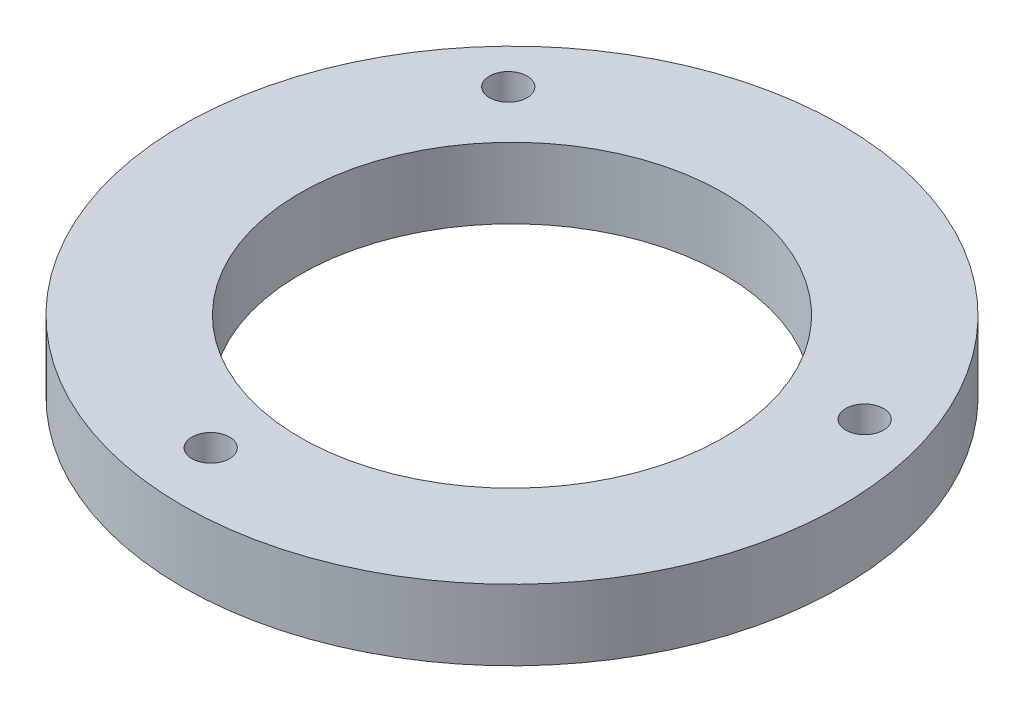
ISO-10303-21;
HEADER;
FILE_DESCRIPTION(('STEP AP214'),'2;1');
FILE_NAME('part.step','',(''),(''),'','','');
FILE_SCHEMA(('AUTOMOTIVE_DESIGN { 1 0 10303 214 1 1 1 1 }'));
ENDSEC;
DATA;
#1=APPLICATION_CONTEXT('core data for automotive mechanical design processes');
#2=APPLICATION_PROTOCOL_DEFINITION('international standard','automotive_design',2000,#1);
#3=PRODUCT_CONTEXT('',#1,'mechanical');
#4=PRODUCT('Part','Part','',(#3));
#5=PRODUCT_RELATED_PRODUCT_CATEGORY('part','',(#4));
#6=PRODUCT_DEFINITION_FORMATION('','',#4);
#7=PRODUCT_DEFINITION_CONTEXT('part definition',#1,'design');
#8=PRODUCT_DEFINITION('design','',#6,#7);
#9=PRODUCT_DEFINITION_SHAPE('','',#8);
#10=(LENGTH_UNIT() NAMED_UNIT(*) SI_UNIT(.MILLI.,.METRE.));
#11=(NAMED_UNIT(*) PLANE_ANGLE_UNIT() SI_UNIT($,.RADIAN.));
#12=(NAMED_UNIT(*) SI_UNIT($,.STERADIAN.) SOLID_ANGLE_UNIT());
#13=UNCERTAINTY_MEASURE_WITH_UNIT(LENGTH_MEASURE(1.E-05),#10,'distance_accuracy_value','');
#14=(GEOMETRIC_REPRESENTATION_CONTEXT(3) GLOBAL_UNCERTAINTY_ASSIGNED_CONTEXT((#13)) GLOBAL_UNIT_ASSIGNED_CONTEXT((#10,
#11,#12)) REPRESENTATION_CONTEXT('',''));
#15=CARTESIAN_POINT('',(0.,0.,0.));
#16=DIRECTION('',(0.,0.,1.));
#17=DIRECTION('',(1.,0.,0.));
#18=AXIS2_PLACEMENT_3D('',#15,#16,#17);
#19=CARTESIAN_POINT('',(0.,7.62,0.));
#20=DIRECTION('',(0.,1.,0.));
#21=DIRECTION('',(0.,0.,1.));
#22=AXIS2_PLACEMENT_3D('',#19,#20,#21);
#23=PLANE('',#22);
#24=CARTESIAN_POINT('',(28.7517939187734,7.62,-9.29972339541891));
#25=DIRECTION('',(0.,1.,0.));
#26=DIRECTION('',(0.,0.,1.));
#27=AXIS2_PLACEMENT_3D('',#24,#25,#26);
#28=CIRCLE('',#27,2.032);
#29=CARTESIAN_POINT('',(28.7517939187734,7.62,-7.26772339541891));
#30=VERTEX_POINT('',#29);
#31=EDGE_CURVE('E62',#30,#30,#28,.T.);
#32=ORIENTED_EDGE('',*,*,#31,.F.);
#33=EDGE_LOOP('',(#32));
#34=FACE_BOUND('',#33,.T.);
#35=CARTESIAN_POINT('',(-3.86372480179012,7.62,28.6479956742244));
#36=DIRECTION('',(0.,1.,0.));
#37=DIRECTION('',(0.,0.,1.));
#38=AXIS2_PLACEMENT_3D('',#35,#36,#37);
#39=CIRCLE('',#38,2.032);
#40=CARTESIAN_POINT('',(-3.86372480179012,7.62,30.6799956742244));
#41=VERTEX_POINT('',#40);
#42=EDGE_CURVE('E56',#41,#41,#39,.T.);
#43=ORIENTED_EDGE('',*,*,#42,.F.);
#44=EDGE_LOOP('',(#43));
#45=FACE_BOUND('',#44,.T.);
#46=CARTESIAN_POINT('',(-21.5402060812266,7.62,-21.1360043257756));
#47=DIRECTION('',(0.,1.,0.));
#48=DIRECTION('',(0.,0.,1.));
#49=AXIS2_PLACEMENT_3D('',#46,#47,#48);
#50=CIRCLE('',#49,2.032);
#51=CARTESIAN_POINT('',(-21.5402060812266,7.62,-19.1040043257756));
#52=VERTEX_POINT('',#51);
#53=EDGE_CURVE('E50',#52,#52,#50,.T.);
#54=ORIENTED_EDGE('',*,*,#53,.F.);
#55=EDGE_LOOP('',(#54));
#56=FACE_BOUND('',#55,.T.);
#57=CARTESIAN_POINT('',(0.,7.62,0.));
#58=DIRECTION('',(0.,1.,0.));
#59=DIRECTION('',(0.,0.,1.));
#60=AXIS2_PLACEMENT_3D('',#57,#58,#59);
#61=CIRCLE('',#60,35.56);
#62=CARTESIAN_POINT('',(0.,7.62,-35.56));
#63=VERTEX_POINT('',#62);
#64=EDGE_CURVE('E10',#63,#63,#61,.T.);
#65=ORIENTED_EDGE('',*,*,#64,.T.);
#66=EDGE_LOOP('',(#65));
#67=FACE_BOUND('',#66,.T.);
#68=CARTESIAN_POINT('',(0.,7.62,0.));
#69=DIRECTION('',(0.,1.,0.));
#70=DIRECTION('',(0.,0.,1.));
#71=AXIS2_PLACEMENT_3D('',#68,#69,#70);
#72=CIRCLE('',#71,22.86);
#73=CARTESIAN_POINT('',(0.,7.62,-22.86));
#74=VERTEX_POINT('',#73);
#75=EDGE_CURVE('E42',#74,#74,#72,.T.);
#76=ORIENTED_EDGE('',*,*,#75,.F.);
#77=EDGE_LOOP('',(#76));
#78=FACE_BOUND('',#77,.T.);
#79=ADVANCED_FACE('F31',(#34,#45,#56,#67,#78),#23,.T.);
#80=CARTESIAN_POINT('',(0.,0.,0.));
#81=DIRECTION('',(0.,1.,0.));
#82=DIRECTION('',(0.,0.,1.));
#83=AXIS2_PLACEMENT_3D('',#80,#81,#82);
#84=PLANE('',#83);
#85=CARTESIAN_POINT('',(28.7517939187734,0.,-9.29972339541891));
#86=DIRECTION('',(0.,1.,0.));
#87=DIRECTION('',(0.,0.,1.));
#88=AXIS2_PLACEMENT_3D('',#85,#86,#87);
#89=CIRCLE('',#88,2.032);
#90=CARTESIAN_POINT('',(28.7517939187734,0.,-7.26772339541891));
#91=VERTEX_POINT('',#90);
#92=EDGE_CURVE('E47',#91,#91,#89,.T.);
#93=ORIENTED_EDGE('',*,*,#92,.T.);
#94=EDGE_LOOP('',(#93));
#95=FACE_BOUND('',#94,.T.);
#96=CARTESIAN_POINT('',(-3.86372480179012,0.,28.6479956742244));
#97=DIRECTION('',(0.,1.,0.));
#98=DIRECTION('',(0.,0.,1.));
#99=AXIS2_PLACEMENT_3D('',#96,#97,#98);
#100=CIRCLE('',#99,2.032);
#101=CARTESIAN_POINT('',(-3.86372480179012,0.,30.6799956742244));
#102=VERTEX_POINT('',#101);
#103=EDGE_CURVE('E59',#102,#102,#100,.T.);
#104=ORIENTED_EDGE('',*,*,#103,.T.);
#105=EDGE_LOOP('',(#104));
#106=FACE_BOUND('',#105,.T.);
#107=CARTESIAN_POINT('',(-21.5402060812266,0.,-21.1360043257756));
#108=DIRECTION('',(0.,1.,0.));
#109=DIRECTION('',(0.,0.,1.));
#110=AXIS2_PLACEMENT_3D('',#107,#108,#109);
#111=CIRCLE('',#110,2.032);
#112=CARTESIAN_POINT('',(-21.5402060812266,0.,-19.1040043257756));
#113=VERTEX_POINT('',#112);
#114=EDGE_CURVE('E53',#113,#113,#111,.T.);
#115=ORIENTED_EDGE('',*,*,#114,.T.);
#116=EDGE_LOOP('',(#115));
#117=FACE_BOUND('',#116,.T.);
#118=CARTESIAN_POINT('',(0.,0.,0.));
#119=DIRECTION('',(0.,1.,0.));
#120=DIRECTION('',(0.,0.,1.));
#121=AXIS2_PLACEMENT_3D('',#118,#119,#120);
#122=CIRCLE('',#121,35.56);
#123=CARTESIAN_POINT('',(0.,0.,-35.56));
#124=VERTEX_POINT('',#123);
#125=EDGE_CURVE('E35',#124,#124,#122,.T.);
#126=ORIENTED_EDGE('',*,*,#125,.F.);
#127=EDGE_LOOP('',(#126));
#128=FACE_BOUND('',#127,.T.);
#129=CARTESIAN_POINT('',(0.,0.,0.));
#130=DIRECTION('',(0.,1.,0.));
#131=DIRECTION('',(0.,0.,1.));
#132=AXIS2_PLACEMENT_3D('',#129,#130,#131);
#133=CIRCLE('',#132,22.86);
#134=CARTESIAN_POINT('',(0.,0.,-22.86));
#135=VERTEX_POINT('',#134);
#136=EDGE_CURVE('E44',#135,#135,#133,.T.);
#137=ORIENTED_EDGE('',*,*,#136,.T.);
#138=EDGE_LOOP('',(#137));
#139=FACE_BOUND('',#138,.T.);
#140=ADVANCED_FACE('F68',(#95,#106,#117,#128,#139),#84,.F.);
#141=CARTESIAN_POINT('',(0.,7.62,0.));
#142=DIRECTION('',(0.,-1.,0.));
#143=DIRECTION('',(0.,0.,-1.));
#144=AXIS2_PLACEMENT_3D('',#141,#142,#143);
#145=CYLINDRICAL_SURFACE('',#144,35.56);
#146=CARTESIAN_POINT('',(0.,7.62,-35.56));
#147=CARTESIAN_POINT('',(0.,7.540625,-35.56));
#148=CARTESIAN_POINT('',(0.,7.46125,-35.56));
#149=CARTESIAN_POINT('',(0.,7.3025,-35.56));
#150=CARTESIAN_POINT('',(0.,7.223125,-35.56));
#151=CARTESIAN_POINT('',(0.,7.064375,-35.56));
#152=CARTESIAN_POINT('',(0.,6.985,-35.56));
#153=CARTESIAN_POINT('',(0.,6.82625,-35.56));
#154=CARTESIAN_POINT('',(0.,6.746875,-35.56));
#155=CARTESIAN_POINT('',(0.,6.588125,-35.56));
#156=CARTESIAN_POINT('',(0.,6.50875,-35.56));
#157=CARTESIAN_POINT('',(0.,6.35,-35.56));
#158=CARTESIAN_POINT('',(0.,6.270625,-35.56));
#159=CARTESIAN_POINT('',(0.,6.111875,-35.56));
#160=CARTESIAN_POINT('',(0.,6.0325,-35.56));
#161=CARTESIAN_POINT('',(0.,5.87375,-35.56));
#162=CARTESIAN_POINT('',(0.,5.794375,-35.56));
#163=CARTESIAN_POINT('',(0.,5.635625,-35.56));
#164=CARTESIAN_POINT('',(0.,5.55625,-35.56));
#165=CARTESIAN_POINT('',(0.,5.3975,-35.56));
#166=CARTESIAN_POINT('',(0.,5.318125,-35.56));
#167=CARTESIAN_POINT('',(0.,5.159375,-35.56));
#168=CARTESIAN_POINT('',(0.,5.08,-35.56));
#169=CARTESIAN_POINT('',(0.,4.92125,-35.56));
#170=CARTESIAN_POINT('',(0.,4.841875,-35.56));
#171=CARTESIAN_POINT('',(0.,4.683125,-35.56));
#172=CARTESIAN_POINT('',(0.,4.60375,-35.56));
#173=CARTESIAN_POINT('',(0.,4.445,-35.56));
#174=CARTESIAN_POINT('',(0.,4.365625,-35.56));
#175=CARTESIAN_POINT('',(0.,4.206875,-35.56));
#176=CARTESIAN_POINT('',(0.,4.1275,-35.56));
#177=CARTESIAN_POINT('',(0.,3.96875,-35.56));
#178=CARTESIAN_POINT('',(0.,3.889375,-35.56));
#179=CARTESIAN_POINT('',(0.,3.730625,-35.56));
#180=CARTESIAN_POINT('',(0.,3.65125,-35.56));
#181=CARTESIAN_POINT('',(0.,3.4925,-35.56));
#182=CARTESIAN_POINT('',(0.,3.413125,-35.56));
#183=CARTESIAN_POINT('',(0.,3.254375,-35.56));
#184=CARTESIAN_POINT('',(0.,3.175,-35.56));
#185=CARTESIAN_POINT('',(0.,3.01625,-35.56));
#186=CARTESIAN_POINT('',(0.,2.936875,-35.56));
#187=CARTESIAN_POINT('',(0.,2.778125,-35.56));
#188=CARTESIAN_POINT('',(0.,2.69875,-35.56));
#189=CARTESIAN_POINT('',(0.,2.54,-35.56));
#190=CARTESIAN_POINT('',(0.,2.460625,-35.56));
#191=CARTESIAN_POINT('',(0.,2.301875,-35.56));
#192=CARTESIAN_POINT('',(0.,2.2225,-35.56));
#193=CARTESIAN_POINT('',(0.,2.06375,-35.56));
#194=CARTESIAN_POINT('',(0.,1.984375,-35.56));
#195=CARTESIAN_POINT('',(0.,1.825625,-35.56));
#196=CARTESIAN_POINT('',(0.,1.74625,-35.56));
#197=CARTESIAN_POINT('',(0.,1.5875,-35.56));
#198=CARTESIAN_POINT('',(0.,1.508125,-35.56));
#199=CARTESIAN_POINT('',(0.,1.349375,-35.56));
#200=CARTESIAN_POINT('',(0.,1.27,-35.56));
#201=CARTESIAN_POINT('',(0.,1.11125,-35.56));
#202=CARTESIAN_POINT('',(0.,1.031875,-35.56));
#203=CARTESIAN_POINT('',(0.,0.873125,-35.56));
#204=CARTESIAN_POINT('',(0.,0.79375,-35.56));
#205=CARTESIAN_POINT('',(0.,0.635,-35.56));
#206=CARTESIAN_POINT('',(0.,0.555625,-35.56));
#207=CARTESIAN_POINT('',(0.,0.396875,-35.56));
#208=CARTESIAN_POINT('',(0.,0.3175,-35.56));
#209=CARTESIAN_POINT('',(0.,0.15875,-35.56));
#210=CARTESIAN_POINT('',(0.,0.0793749999999999,-35.56));
#211=CARTESIAN_POINT('',(0.,0.,-35.56));
#212=B_SPLINE_CURVE_WITH_KNOTS('',3,(#146,#147,#148,#149,#150,#151,#152,#153,#154,#155,#156,
#157,#158,#159,#160,#161,#162,#163,#164,#165,#166,#167,#168,#169,#170,#171,#172,#173,#174,#175,
#176,#177,#178,#179,#180,#181,#182,#183,#184,#185,#186,#187,#188,#189,#190,#191,#192,#193,#194,
#195,#196,#197,#198,#199,#200,#201,#202,#203,#204,#205,#206,#207,#208,#209,#210,#211),
.UNSPECIFIED.,.F.,.F.,(4,2,2,2,2,2,2,2,2,2,2,2,2,2,2,2,2,2,2,2,2,2,2,2,2,2,2,2,2,2,2,2,4),(0.,
0.238125,0.476249999999999,0.714375,0.952499999999999,1.190625,1.42875,1.666875,1.905,2.143125,
2.38125,2.619375,2.8575,3.095625,3.33375,3.571875,3.81,4.048125,4.28625,4.524375,4.7625,
5.000625,5.23875,5.476875,5.715,5.953125,6.19125,6.429375,6.6675,6.905625,7.14375,7.381875,
7.62),.UNSPECIFIED.);
#213=EDGE_CURVE('BSEAM33',#63,#124,#212,.T.);
#214=ORIENTED_EDGE('',*,*,#64,.F.);
#215=ORIENTED_EDGE('',*,*,#125,.T.);
#216=ORIENTED_EDGE('',*,*,#213,.T.);
#217=ORIENTED_EDGE('',*,*,#213,.F.);
#218=EDGE_LOOP('',(#214,#216,#215,#217));
#219=FACE_BOUND('',#218,.T.);
#220=ADVANCED_FACE('F33',(#219),#145,.T.);
#221=CARTESIAN_POINT('',(0.,7.62,0.));
#222=DIRECTION('',(0.,-1.,0.));
#223=DIRECTION('',(0.,0.,-1.));
#224=AXIS2_PLACEMENT_3D('',#221,#222,#223);
#225=CYLINDRICAL_SURFACE('',#224,22.86);
#226=CARTESIAN_POINT('',(0.,7.62,-22.86));
#227=CARTESIAN_POINT('',(0.,7.540625,-22.86));
#228=CARTESIAN_POINT('',(0.,7.46125,-22.86));
#229=CARTESIAN_POINT('',(0.,7.3025,-22.86));
#230=CARTESIAN_POINT('',(0.,7.223125,-22.86));
#231=CARTESIAN_POINT('',(0.,7.064375,-22.86));
#232=CARTESIAN_POINT('',(0.,6.985,-22.86));
#233=CARTESIAN_POINT('',(0.,6.82625,-22.86));
#234=CARTESIAN_POINT('',(0.,6.746875,-22.86));
#235=CARTESIAN_POINT('',(0.,6.588125,-22.86));
#236=CARTESIAN_POINT('',(0.,6.50875,-22.86));
#237=CARTESIAN_POINT('',(0.,6.35,-22.86));
#238=CARTESIAN_POINT('',(0.,6.270625,-22.86));
#239=CARTESIAN_POINT('',(0.,6.111875,-22.86));
#240=CARTESIAN_POINT('',(0.,6.0325,-22.86));
#241=CARTESIAN_POINT('',(0.,5.87375,-22.86));
#242=CARTESIAN_POINT('',(0.,5.794375,-22.86));
#243=CARTESIAN_POINT('',(0.,5.635625,-22.86));
#244=CARTESIAN_POINT('',(0.,5.55625,-22.86));
#245=CARTESIAN_POINT('',(0.,5.3975,-22.86));
#246=CARTESIAN_POINT('',(0.,5.318125,-22.86));
#247=CARTESIAN_POINT('',(0.,5.159375,-22.86));
#248=CARTESIAN_POINT('',(0.,5.08,-22.86));
#249=CARTESIAN_POINT('',(0.,4.92125,-22.86));
#250=CARTESIAN_POINT('',(0.,4.841875,-22.86));
#251=CARTESIAN_POINT('',(0.,4.683125,-22.86));
#252=CARTESIAN_POINT('',(0.,4.60375,-22.86));
#253=CARTESIAN_POINT('',(0.,4.445,-22.86));
#254=CARTESIAN_POINT('',(0.,4.365625,-22.86));
#255=CARTESIAN_POINT('',(0.,4.206875,-22.86));
#256=CARTESIAN_POINT('',(0.,4.1275,-22.86));
#257=CARTESIAN_POINT('',(0.,3.96875,-22.86));
#258=CARTESIAN_POINT('',(0.,3.889375,-22.86));
#259=CARTESIAN_POINT('',(0.,3.730625,-22.86));
#260=CARTESIAN_POINT('',(0.,3.65125,-22.86));
#261=CARTESIAN_POINT('',(0.,3.4925,-22.86));
#262=CARTESIAN_POINT('',(0.,3.413125,-22.86));
#263=CARTESIAN_POINT('',(0.,3.254375,-22.86));
#264=CARTESIAN_POINT('',(0.,3.175,-22.86));
#265=CARTESIAN_POINT('',(0.,3.01625,-22.86));
#266=CARTESIAN_POINT('',(0.,2.936875,-22.86));
#267=CARTESIAN_POINT('',(0.,2.778125,-22.86));
#268=CARTESIAN_POINT('',(0.,2.69875,-22.86));
#269=CARTESIAN_POINT('',(0.,2.54,-22.86));
#270=CARTESIAN_POINT('',(0.,2.460625,-22.86));
#271=CARTESIAN_POINT('',(0.,2.301875,-22.86));
#272=CARTESIAN_POINT('',(0.,2.2225,-22.86));
#273=CARTESIAN_POINT('',(0.,2.06375,-22.86));
#274=CARTESIAN_POINT('',(0.,1.984375,-22.86));
#275=CARTESIAN_POINT('',(0.,1.825625,-22.86));
#276=CARTESIAN_POINT('',(0.,1.74625,-22.86));
#277=CARTESIAN_POINT('',(0.,1.5875,-22.86));
#278=CARTESIAN_POINT('',(0.,1.508125,-22.86));
#279=CARTESIAN_POINT('',(0.,1.349375,-22.86));
#280=CARTESIAN_POINT('',(0.,1.27,-22.86));
#281=CARTESIAN_POINT('',(0.,1.11125,-22.86));
#282=CARTESIAN_POINT('',(0.,1.031875,-22.86));
#283=CARTESIAN_POINT('',(0.,0.873125,-22.86));
#284=CARTESIAN_POINT('',(0.,0.79375,-22.86));
#285=CARTESIAN_POINT('',(0.,0.635,-22.86));
#286=CARTESIAN_POINT('',(0.,0.555625,-22.86));
#287=CARTESIAN_POINT('',(0.,0.396875,-22.86));
#288=CARTESIAN_POINT('',(0.,0.3175,-22.86));
#289=CARTESIAN_POINT('',(0.,0.15875,-22.86));
#290=CARTESIAN_POINT('',(0.,0.0793749999999999,-22.86));
#291=CARTESIAN_POINT('',(0.,0.,-22.86));
#292=B_SPLINE_CURVE_WITH_KNOTS('',3,(#226,#227,#228,#229,#230,#231,#232,#233,#234,#235,#236,
#237,#238,#239,#240,#241,#242,#243,#244,#245,#246,#247,#248,#249,#250,#251,#252,#253,#254,#255,
#256,#257,#258,#259,#260,#261,#262,#263,#264,#265,#266,#267,#268,#269,#270,#271,#272,#273,#274,
#275,#276,#277,#278,#279,#280,#281,#282,#283,#284,#285,#286,#287,#288,#289,#290,#291),
.UNSPECIFIED.,.F.,.F.,(4,2,2,2,2,2,2,2,2,2,2,2,2,2,2,2,2,2,2,2,2,2,2,2,2,2,2,2,2,2,2,2,4),(0.,
0.238125,0.476249999999999,0.714375,0.952499999999999,1.190625,1.42875,1.666875,1.905,2.143125,
2.38125,2.619375,2.8575,3.095625,3.33375,3.571875,3.81,4.048125,4.28625,4.524375,4.7625,
5.000625,5.23875,5.476875,5.715,5.953125,6.19125,6.429375,6.6675,6.905625,7.14375,7.381875,
7.62),.UNSPECIFIED.);
#293=EDGE_CURVE('BSEAM87',#74,#135,#292,.T.);
#294=ORIENTED_EDGE('',*,*,#75,.T.);
#295=ORIENTED_EDGE('',*,*,#136,.F.);
#296=ORIENTED_EDGE('',*,*,#293,.T.);
#297=ORIENTED_EDGE('',*,*,#293,.F.);
#298=EDGE_LOOP('',(#294,#296,#295,#297));
#299=FACE_BOUND('',#298,.T.);
#300=ADVANCED_FACE('F87',(#299),#225,.F.);
#301=CARTESIAN_POINT('',(-21.5402060812266,0.,-21.1360043257756));
#302=DIRECTION('',(0.,1.,0.));
#303=DIRECTION('',(0.,0.,1.));
#304=AXIS2_PLACEMENT_3D('',#301,#302,#303);
#305=CYLINDRICAL_SURFACE('',#304,2.032);
#306=CARTESIAN_POINT('',(-21.5402060812266,0.,-19.1040043257756));
#307=CARTESIAN_POINT('',(-21.5402060812266,0.0793749999999998,-19.1040043257756));
#308=CARTESIAN_POINT('',(-21.5402060812266,0.15875,-19.1040043257756));
#309=CARTESIAN_POINT('',(-21.5402060812266,0.3175,-19.1040043257756));
#310=CARTESIAN_POINT('',(-21.5402060812266,0.396875,-19.1040043257756));
#311=CARTESIAN_POINT('',(-21.5402060812266,0.555625,-19.1040043257756));
#312=CARTESIAN_POINT('',(-21.5402060812266,0.635,-19.1040043257756));
#313=CARTESIAN_POINT('',(-21.5402060812266,0.79375,-19.1040043257756));
#314=CARTESIAN_POINT('',(-21.5402060812266,0.873125,-19.1040043257756));
#315=CARTESIAN_POINT('',(-21.5402060812266,1.031875,-19.1040043257756));
#316=CARTESIAN_POINT('',(-21.5402060812266,1.11125,-19.1040043257756));
#317=CARTESIAN_POINT('',(-21.5402060812266,1.27,-19.1040043257756));
#318=CARTESIAN_POINT('',(-21.5402060812266,1.349375,-19.1040043257756));
#319=CARTESIAN_POINT('',(-21.5402060812266,1.508125,-19.1040043257756));
#320=CARTESIAN_POINT('',(-21.5402060812266,1.5875,-19.1040043257756));
#321=CARTESIAN_POINT('',(-21.5402060812266,1.74625,-19.1040043257756));
#322=CARTESIAN_POINT('',(-21.5402060812266,1.825625,-19.1040043257756));
#323=CARTESIAN_POINT('',(-21.5402060812266,1.984375,-19.1040043257756));
#324=CARTESIAN_POINT('',(-21.5402060812266,2.06375,-19.1040043257756));
#325=CARTESIAN_POINT('',(-21.5402060812266,2.2225,-19.1040043257756));
#326=CARTESIAN_POINT('',(-21.5402060812266,2.301875,-19.1040043257756));
#327=CARTESIAN_POINT('',(-21.5402060812266,2.460625,-19.1040043257756));
#328=CARTESIAN_POINT('',(-21.5402060812266,2.54,-19.1040043257756));
#329=CARTESIAN_POINT('',(-21.5402060812266,2.69875,-19.1040043257756));
#330=CARTESIAN_POINT('',(-21.5402060812266,2.778125,-19.1040043257756));
#331=CARTESIAN_POINT('',(-21.5402060812266,2.936875,-19.1040043257756));
#332=CARTESIAN_POINT('',(-21.5402060812266,3.01625,-19.1040043257756));
#333=CARTESIAN_POINT('',(-21.5402060812266,3.175,-19.1040043257756));
#334=CARTESIAN_POINT('',(-21.5402060812266,3.254375,-19.1040043257756));
#335=CARTESIAN_POINT('',(-21.5402060812266,3.413125,-19.1040043257756));
#336=CARTESIAN_POINT('',(-21.5402060812266,3.4925,-19.1040043257756));
#337=CARTESIAN_POINT('',(-21.5402060812266,3.65125,-19.1040043257756));
#338=CARTESIAN_POINT('',(-21.5402060812266,3.730625,-19.1040043257756));
#339=CARTESIAN_POINT('',(-21.5402060812266,3.889375,-19.1040043257756));
#340=CARTESIAN_POINT('',(-21.5402060812266,3.96875,-19.1040043257756));
#341=CARTESIAN_POINT('',(-21.5402060812266,4.1275,-19.1040043257756));
#342=CARTESIAN_POINT('',(-21.5402060812266,4.206875,-19.1040043257756));
#343=CARTESIAN_POINT('',(-21.5402060812266,4.365625,-19.1040043257756));
#344=CARTESIAN_POINT('',(-21.5402060812266,4.445,-19.1040043257756));
#345=CARTESIAN_POINT('',(-21.5402060812266,4.60375,-19.1040043257756));
#346=CARTESIAN_POINT('',(-21.5402060812266,4.683125,-19.1040043257756));
#347=CARTESIAN_POINT('',(-21.5402060812266,4.841875,-19.1040043257756));
#348=CARTESIAN_POINT('',(-21.5402060812266,4.92125,-19.1040043257756));
#349=CARTESIAN_POINT('',(-21.5402060812266,5.08,-19.1040043257756));
#350=CARTESIAN_POINT('',(-21.5402060812266,5.159375,-19.1040043257756));
#351=CARTESIAN_POINT('',(-21.5402060812266,5.318125,-19.1040043257756));
#352=CARTESIAN_POINT('',(-21.5402060812266,5.3975,-19.1040043257756));
#353=CARTESIAN_POINT('',(-21.5402060812266,5.55625,-19.1040043257756));
#354=CARTESIAN_POINT('',(-21.5402060812266,5.635625,-19.1040043257756));
#355=CARTESIAN_POINT('',(-21.5402060812266,5.794375,-19.1040043257756));
#356=CARTESIAN_POINT('',(-21.5402060812266,5.87375,-19.1040043257756));
#357=CARTESIAN_POINT('',(-21.5402060812266,6.0325,-19.1040043257756));
#358=CARTESIAN_POINT('',(-21.5402060812266,6.111875,-19.1040043257756));
#359=CARTESIAN_POINT('',(-21.5402060812266,6.270625,-19.1040043257756));
#360=CARTESIAN_POINT('',(-21.5402060812266,6.35,-19.1040043257756));
#361=CARTESIAN_POINT('',(-21.5402060812266,6.50875,-19.1040043257756));
#362=CARTESIAN_POINT('',(-21.5402060812266,6.588125,-19.1040043257756));
#363=CARTESIAN_POINT('',(-21.5402060812266,6.746875,-19.1040043257756));
#364=CARTESIAN_POINT('',(-21.5402060812266,6.82625,-19.1040043257756));
#365=CARTESIAN_POINT('',(-21.5402060812266,6.985,-19.1040043257756));
#366=CARTESIAN_POINT('',(-21.5402060812266,7.064375,-19.1040043257756));
#367=CARTESIAN_POINT('',(-21.5402060812266,7.223125,-19.1040043257756));
#368=CARTESIAN_POINT('',(-21.5402060812266,7.3025,-19.1040043257756));
#369=CARTESIAN_POINT('',(-21.5402060812266,7.46125,-19.1040043257756));
#370=CARTESIAN_POINT('',(-21.5402060812266,7.540625,-19.1040043257756));
#371=CARTESIAN_POINT('',(-21.5402060812266,7.62,-19.1040043257756));
#372=B_SPLINE_CURVE_WITH_KNOTS('',3,(#306,#307,#308,#309,#310,#311,#312,#313,#314,#315,#316,
#317,#318,#319,#320,#321,#322,#323,#324,#325,#326,#327,#328,#329,#330,#331,#332,#333,#334,#335,
#336,#337,#338,#339,#340,#341,#342,#343,#344,#345,#346,#347,#348,#349,#350,#351,#352,#353,#354,
#355,#356,#357,#358,#359,#360,#361,#362,#363,#364,#365,#366,#367,#368,#369,#370,#371),
.UNSPECIFIED.,.F.,.F.,(4,2,2,2,2,2,2,2,2,2,2,2,2,2,2,2,2,2,2,2,2,2,2,2,2,2,2,2,2,2,2,2,4),(0.,
0.238125,0.47625,0.714375,0.9525,1.190625,1.42875,1.666875,1.905,2.143125,2.38125,2.619375,
2.8575,3.095625,3.33375,3.571875,3.81,4.048125,4.28625,4.524375,4.7625,5.000625,5.23875,
5.476875,5.715,5.953125,6.19125,6.429375,6.6675,6.905625,7.14375,7.381875,7.62),.UNSPECIFIED.);
#373=EDGE_CURVE('BSEAM90',#113,#52,#372,.T.);
#374=ORIENTED_EDGE('',*,*,#114,.F.);
#375=ORIENTED_EDGE('',*,*,#53,.T.);
#376=ORIENTED_EDGE('',*,*,#373,.T.);
#377=ORIENTED_EDGE('',*,*,#373,.F.);
#378=EDGE_LOOP('',(#374,#376,#375,#377));
#379=FACE_BOUND('',#378,.T.);
#380=ADVANCED_FACE('F90',(#379),#305,.F.);
#381=CARTESIAN_POINT('',(-3.86372480179012,0.,28.6479956742244));
#382=DIRECTION('',(0.,1.,0.));
#383=DIRECTION('',(0.,0.,1.));
#384=AXIS2_PLACEMENT_3D('',#381,#382,#383);
#385=CYLINDRICAL_SURFACE('',#384,2.032);
#386=CARTESIAN_POINT('',(-3.86372480179012,0.,30.6799956742244));
#387=CARTESIAN_POINT('',(-3.86372480179012,0.0793749999999998,30.6799956742244));
#388=CARTESIAN_POINT('',(-3.86372480179012,0.15875,30.6799956742244));
#389=CARTESIAN_POINT('',(-3.86372480179012,0.3175,30.6799956742244));
#390=CARTESIAN_POINT('',(-3.86372480179012,0.396875,30.6799956742244));
#391=CARTESIAN_POINT('',(-3.86372480179012,0.555625,30.6799956742244));
#392=CARTESIAN_POINT('',(-3.86372480179012,0.635,30.6799956742244));
#393=CARTESIAN_POINT('',(-3.86372480179012,0.79375,30.6799956742244));
#394=CARTESIAN_POINT('',(-3.86372480179012,0.873125,30.6799956742244));
#395=CARTESIAN_POINT('',(-3.86372480179012,1.031875,30.6799956742244));
#396=CARTESIAN_POINT('',(-3.86372480179012,1.11125,30.6799956742244));
#397=CARTESIAN_POINT('',(-3.86372480179012,1.27,30.6799956742244));
#398=CARTESIAN_POINT('',(-3.86372480179012,1.349375,30.6799956742244));
#399=CARTESIAN_POINT('',(-3.86372480179012,1.508125,30.6799956742244));
#400=CARTESIAN_POINT('',(-3.86372480179012,1.5875,30.6799956742244));
#401=CARTESIAN_POINT('',(-3.86372480179012,1.74625,30.6799956742244));
#402=CARTESIAN_POINT('',(-3.86372480179012,1.825625,30.6799956742244));
#403=CARTESIAN_POINT('',(-3.86372480179012,1.984375,30.6799956742244));
#404=CARTESIAN_POINT('',(-3.86372480179012,2.06375,30.6799956742244));
#405=CARTESIAN_POINT('',(-3.86372480179012,2.2225,30.6799956742244));
#406=CARTESIAN_POINT('',(-3.86372480179012,2.301875,30.6799956742244));
#407=CARTESIAN_POINT('',(-3.86372480179012,2.460625,30.6799956742244));
#408=CARTESIAN_POINT('',(-3.86372480179012,2.54,30.6799956742244));
#409=CARTESIAN_POINT('',(-3.86372480179012,2.69875,30.6799956742244));
#410=CARTESIAN_POINT('',(-3.86372480179012,2.778125,30.6799956742244));
#411=CARTESIAN_POINT('',(-3.86372480179012,2.936875,30.6799956742244));
#412=CARTESIAN_POINT('',(-3.86372480179012,3.01625,30.6799956742244));
#413=CARTESIAN_POINT('',(-3.86372480179012,3.175,30.6799956742244));
#414=CARTESIAN_POINT('',(-3.86372480179012,3.254375,30.6799956742244));
#415=CARTESIAN_POINT('',(-3.86372480179012,3.413125,30.6799956742244));
#416=CARTESIAN_POINT('',(-3.86372480179012,3.4925,30.6799956742244));
#417=CARTESIAN_POINT('',(-3.86372480179012,3.65125,30.6799956742244));
#418=CARTESIAN_POINT('',(-3.86372480179012,3.730625,30.6799956742244));
#419=CARTESIAN_POINT('',(-3.86372480179012,3.889375,30.6799956742244));
#420=CARTESIAN_POINT('',(-3.86372480179012,3.96875,30.6799956742244));
#421=CARTESIAN_POINT('',(-3.86372480179012,4.1275,30.6799956742244));
#422=CARTESIAN_POINT('',(-3.86372480179012,4.206875,30.6799956742244));
#423=CARTESIAN_POINT('',(-3.86372480179012,4.365625,30.6799956742244));
#424=CARTESIAN_POINT('',(-3.86372480179012,4.445,30.6799956742244));
#425=CARTESIAN_POINT('',(-3.86372480179012,4.60375,30.6799956742244));
#426=CARTESIAN_POINT('',(-3.86372480179012,4.683125,30.6799956742244));
#427=CARTESIAN_POINT('',(-3.86372480179012,4.841875,30.6799956742244));
#428=CARTESIAN_POINT('',(-3.86372480179012,4.92125,30.6799956742244));
#429=CARTESIAN_POINT('',(-3.86372480179012,5.08,30.6799956742244));
#430=CARTESIAN_POINT('',(-3.86372480179012,5.159375,30.6799956742244));
#431=CARTESIAN_POINT('',(-3.86372480179012,5.318125,30.6799956742244));
#432=CARTESIAN_POINT('',(-3.86372480179012,5.3975,30.6799956742244));
#433=CARTESIAN_POINT('',(-3.86372480179012,5.55625,30.6799956742244));
#434=CARTESIAN_POINT('',(-3.86372480179012,5.635625,30.6799956742244));
#435=CARTESIAN_POINT('',(-3.86372480179012,5.794375,30.6799956742244));
#436=CARTESIAN_POINT('',(-3.86372480179012,5.87375,30.6799956742244));
#437=CARTESIAN_POINT('',(-3.86372480179012,6.0325,30.6799956742244));
#438=CARTESIAN_POINT('',(-3.86372480179012,6.111875,30.6799956742244));
#439=CARTESIAN_POINT('',(-3.86372480179012,6.270625,30.6799956742244));
#440=CARTESIAN_POINT('',(-3.86372480179012,6.35,30.6799956742244));
#441=CARTESIAN_POINT('',(-3.86372480179012,6.50875,30.6799956742244));
#442=CARTESIAN_POINT('',(-3.86372480179012,6.588125,30.6799956742244));
#443=CARTESIAN_POINT('',(-3.86372480179012,6.746875,30.6799956742244));
#444=CARTESIAN_POINT('',(-3.86372480179012,6.82625,30.6799956742244));
#445=CARTESIAN_POINT('',(-3.86372480179012,6.985,30.6799956742244));
#446=CARTESIAN_POINT('',(-3.86372480179012,7.064375,30.6799956742244));
#447=CARTESIAN_POINT('',(-3.86372480179012,7.223125,30.6799956742244));
#448=CARTESIAN_POINT('',(-3.86372480179012,7.3025,30.6799956742244));
#449=CARTESIAN_POINT('',(-3.86372480179012,7.46125,30.6799956742244));
#450=CARTESIAN_POINT('',(-3.86372480179012,7.540625,30.6799956742244));
#451=CARTESIAN_POINT('',(-3.86372480179012,7.62,30.6799956742244));
#452=B_SPLINE_CURVE_WITH_KNOTS('',3,(#386,#387,#388,#389,#390,#391,#392,#393,#394,#395,#396,
#397,#398,#399,#400,#401,#402,#403,#404,#405,#406,#407,#408,#409,#410,#411,#412,#413,#414,#415,
#416,#417,#418,#419,#420,#421,#422,#423,#424,#425,#426,#427,#428,#429,#430,#431,#432,#433,#434,
#435,#436,#437,#438,#439,#440,#441,#442,#443,#444,#445,#446,#447,#448,#449,#450,#451),
.UNSPECIFIED.,.F.,.F.,(4,2,2,2,2,2,2,2,2,2,2,2,2,2,2,2,2,2,2,2,2,2,2,2,2,2,2,2,2,2,2,2,4),(0.,
0.238125,0.47625,0.714375,0.9525,1.190625,1.42875,1.666875,1.905,2.143125,2.38125,2.619375,
2.8575,3.095625,3.33375,3.571875,3.81,4.048125,4.28625,4.524375,4.7625,5.000625,5.23875,
5.476875,5.715,5.953125,6.19125,6.429375,6.6675,6.905625,7.14375,7.381875,7.62),.UNSPECIFIED.);
#453=EDGE_CURVE('BSEAM74',#102,#41,#452,.T.);
#454=ORIENTED_EDGE('',*,*,#103,.F.);
#455=ORIENTED_EDGE('',*,*,#42,.T.);
#456=ORIENTED_EDGE('',*,*,#453,.T.);
#457=ORIENTED_EDGE('',*,*,#453,.F.);
#458=EDGE_LOOP('',(#454,#456,#455,#457));
#459=FACE_BOUND('',#458,.T.);
#460=ADVANCED_FACE('F74',(#459),#385,.F.);
#461=CARTESIAN_POINT('',(28.7517939187734,0.,-9.29972339541891));
#462=DIRECTION('',(0.,1.,0.));
#463=DIRECTION('',(0.,0.,1.));
#464=AXIS2_PLACEMENT_3D('',#461,#462,#463);
#465=CYLINDRICAL_SURFACE('',#464,2.032);
#466=CARTESIAN_POINT('',(28.7517939187734,0.,-7.26772339541891));
#467=CARTESIAN_POINT('',(28.7517939187734,0.0793749999999998,-7.26772339541891));
#468=CARTESIAN_POINT('',(28.7517939187734,0.15875,-7.26772339541891));
#469=CARTESIAN_POINT('',(28.7517939187734,0.3175,-7.26772339541891));
#470=CARTESIAN_POINT('',(28.7517939187734,0.396875,-7.26772339541891));
#471=CARTESIAN_POINT('',(28.7517939187734,0.555625,-7.26772339541891));
#472=CARTESIAN_POINT('',(28.7517939187734,0.635,-7.26772339541891));
#473=CARTESIAN_POINT('',(28.7517939187734,0.79375,-7.26772339541891));
#474=CARTESIAN_POINT('',(28.7517939187734,0.873125,-7.26772339541891));
#475=CARTESIAN_POINT('',(28.7517939187734,1.031875,-7.26772339541891));
#476=CARTESIAN_POINT('',(28.7517939187734,1.11125,-7.26772339541891));
#477=CARTESIAN_POINT('',(28.7517939187734,1.27,-7.26772339541891));
#478=CARTESIAN_POINT('',(28.7517939187734,1.349375,-7.26772339541891));
#479=CARTESIAN_POINT('',(28.7517939187734,1.508125,-7.26772339541891));
#480=CARTESIAN_POINT('',(28.7517939187734,1.5875,-7.26772339541891));
#481=CARTESIAN_POINT('',(28.7517939187734,1.74625,-7.26772339541891));
#482=CARTESIAN_POINT('',(28.7517939187734,1.825625,-7.26772339541891));
#483=CARTESIAN_POINT('',(28.7517939187734,1.984375,-7.26772339541891));
#484=CARTESIAN_POINT('',(28.7517939187734,2.06375,-7.26772339541891));
#485=CARTESIAN_POINT('',(28.7517939187734,2.2225,-7.26772339541891));
#486=CARTESIAN_POINT('',(28.7517939187734,2.301875,-7.26772339541891));
#487=CARTESIAN_POINT('',(28.7517939187734,2.460625,-7.26772339541891));
#488=CARTESIAN_POINT('',(28.7517939187734,2.54,-7.26772339541891));
#489=CARTESIAN_POINT('',(28.7517939187734,2.69875,-7.26772339541891));
#490=CARTESIAN_POINT('',(28.7517939187734,2.778125,-7.26772339541891));
#491=CARTESIAN_POINT('',(28.7517939187734,2.936875,-7.26772339541891));
#492=CARTESIAN_POINT('',(28.7517939187734,3.01625,-7.26772339541891));
#493=CARTESIAN_POINT('',(28.7517939187734,3.175,-7.26772339541891));
#494=CARTESIAN_POINT('',(28.7517939187734,3.254375,-7.26772339541891));
#495=CARTESIAN_POINT('',(28.7517939187734,3.413125,-7.26772339541891));
#496=CARTESIAN_POINT('',(28.7517939187734,3.4925,-7.26772339541891));
#497=CARTESIAN_POINT('',(28.7517939187734,3.65125,-7.26772339541891));
#498=CARTESIAN_POINT('',(28.7517939187734,3.730625,-7.26772339541891));
#499=CARTESIAN_POINT('',(28.7517939187734,3.889375,-7.26772339541891));
#500=CARTESIAN_POINT('',(28.7517939187734,3.96875,-7.26772339541891));
#501=CARTESIAN_POINT('',(28.7517939187734,4.1275,-7.26772339541891));
#502=CARTESIAN_POINT('',(28.7517939187734,4.206875,-7.26772339541891));
#503=CARTESIAN_POINT('',(28.7517939187734,4.365625,-7.26772339541891));
#504=CARTESIAN_POINT('',(28.7517939187734,4.445,-7.26772339541891));
#505=CARTESIAN_POINT('',(28.7517939187734,4.60375,-7.26772339541891));
#506=CARTESIAN_POINT('',(28.7517939187734,4.683125,-7.26772339541891));
#507=CARTESIAN_POINT('',(28.7517939187734,4.841875,-7.26772339541891));
#508=CARTESIAN_POINT('',(28.7517939187734,4.92125,-7.26772339541891));
#509=CARTESIAN_POINT('',(28.7517939187734,5.08,-7.26772339541891));
#510=CARTESIAN_POINT('',(28.7517939187734,5.159375,-7.26772339541891));
#511=CARTESIAN_POINT('',(28.7517939187734,5.318125,-7.26772339541891));
#512=CARTESIAN_POINT('',(28.7517939187734,5.3975,-7.26772339541891));
#513=CARTESIAN_POINT('',(28.7517939187734,5.55625,-7.26772339541891));
#514=CARTESIAN_POINT('',(28.7517939187734,5.635625,-7.26772339541891));
#515=CARTESIAN_POINT('',(28.7517939187734,5.794375,-7.26772339541891));
#516=CARTESIAN_POINT('',(28.7517939187734,5.87375,-7.26772339541891));
#517=CARTESIAN_POINT('',(28.7517939187734,6.0325,-7.26772339541891));
#518=CARTESIAN_POINT('',(28.7517939187734,6.111875,-7.26772339541891));
#519=CARTESIAN_POINT('',(28.7517939187734,6.270625,-7.26772339541891));
#520=CARTESIAN_POINT('',(28.7517939187734,6.35,-7.26772339541891));
#521=CARTESIAN_POINT('',(28.7517939187734,6.50875,-7.26772339541891));
#522=CARTESIAN_POINT('',(28.7517939187734,6.588125,-7.26772339541891));
#523=CARTESIAN_POINT('',(28.7517939187734,6.746875,-7.26772339541891));
#524=CARTESIAN_POINT('',(28.7517939187734,6.82625,-7.26772339541891));
#525=CARTESIAN_POINT('',(28.7517939187734,6.985,-7.26772339541891));
#526=CARTESIAN_POINT('',(28.7517939187734,7.064375,-7.26772339541891));
#527=CARTESIAN_POINT('',(28.7517939187734,7.223125,-7.26772339541891));
#528=CARTESIAN_POINT('',(28.7517939187734,7.3025,-7.26772339541891));
#529=CARTESIAN_POINT('',(28.7517939187734,7.46125,-7.26772339541891));
#530=CARTESIAN_POINT('',(28.7517939187734,7.540625,-7.26772339541891));
#531=CARTESIAN_POINT('',(28.7517939187734,7.62,-7.26772339541891));
#532=B_SPLINE_CURVE_WITH_KNOTS('',3,(#466,#467,#468,#469,#470,#471,#472,#473,#474,#475,#476,
#477,#478,#479,#480,#481,#482,#483,#484,#485,#486,#487,#488,#489,#490,#491,#492,#493,#494,#495,
#496,#497,#498,#499,#500,#501,#502,#503,#504,#505,#506,#507,#508,#509,#510,#511,#512,#513,#514,
#515,#516,#517,#518,#519,#520,#521,#522,#523,#524,#525,#526,#527,#528,#529,#530,#531),
.UNSPECIFIED.,.F.,.F.,(4,2,2,2,2,2,2,2,2,2,2,2,2,2,2,2,2,2,2,2,2,2,2,2,2,2,2,2,2,2,2,2,4),(0.,
0.238125,0.47625,0.714375,0.9525,1.190625,1.42875,1.666875,1.905,2.143125,2.38125,2.619375,
2.8575,3.095625,3.33375,3.571875,3.81,4.048125,4.28625,4.524375,4.7625,5.000625,5.23875,
5.476875,5.715,5.953125,6.19125,6.429375,6.6675,6.905625,7.14375,7.381875,7.62),.UNSPECIFIED.);
#533=EDGE_CURVE('BSEAM71',#91,#30,#532,.T.);
#534=ORIENTED_EDGE('',*,*,#92,.F.);
#535=ORIENTED_EDGE('',*,*,#31,.T.);
#536=ORIENTED_EDGE('',*,*,#533,.T.);
#537=ORIENTED_EDGE('',*,*,#533,.F.);
#538=EDGE_LOOP('',(#534,#536,#535,#537));
#539=FACE_BOUND('',#538,.T.);
#540=ADVANCED_FACE('F71',(#539),#465,.F.);
#541=CLOSED_SHELL('',(#79,#140,#220,#300,#380,#460,#540));
#542=MANIFOLD_SOLID_BREP('B2',#541);
#543=ADVANCED_BREP_SHAPE_REPRESENTATION('',(#18,#542),#14);
#544=SHAPE_DEFINITION_REPRESENTATION(#9,#543);
ENDSEC;
END-ISO-10303-21;
